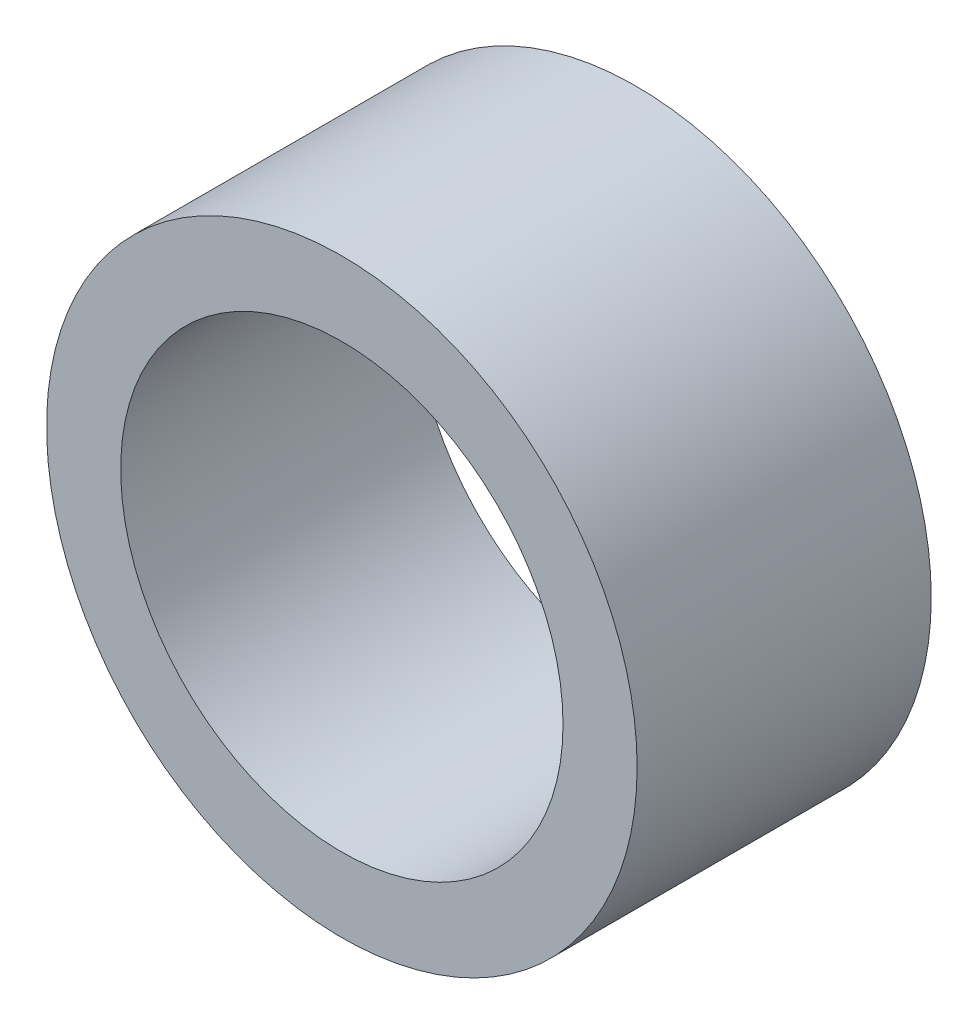
ISO-10303-21;
HEADER;
FILE_DESCRIPTION(('STEP AP214'),'2;1');
FILE_NAME('part.step','',(''),(''),'','','');
FILE_SCHEMA(('AUTOMOTIVE_DESIGN { 1 0 10303 214 1 1 1 1 }'));
ENDSEC;
DATA;
#1=APPLICATION_CONTEXT('core data for automotive mechanical design processes');
#2=APPLICATION_PROTOCOL_DEFINITION('international standard','automotive_design',2000,#1);
#3=PRODUCT_CONTEXT('',#1,'mechanical');
#4=PRODUCT('Part','Part','',(#3));
#5=PRODUCT_RELATED_PRODUCT_CATEGORY('part','',(#4));
#6=PRODUCT_DEFINITION_FORMATION('','',#4);
#7=PRODUCT_DEFINITION_CONTEXT('part definition',#1,'design');
#8=PRODUCT_DEFINITION('design','',#6,#7);
#9=PRODUCT_DEFINITION_SHAPE('','',#8);
#10=(LENGTH_UNIT() NAMED_UNIT(*) SI_UNIT(.MILLI.,.METRE.));
#11=(NAMED_UNIT(*) PLANE_ANGLE_UNIT() SI_UNIT($,.RADIAN.));
#12=(NAMED_UNIT(*) SI_UNIT($,.STERADIAN.) SOLID_ANGLE_UNIT());
#13=UNCERTAINTY_MEASURE_WITH_UNIT(LENGTH_MEASURE(1.E-05),#10,'distance_accuracy_value','');
#14=(GEOMETRIC_REPRESENTATION_CONTEXT(3) GLOBAL_UNCERTAINTY_ASSIGNED_CONTEXT((#13)) GLOBAL_UNIT_ASSIGNED_CONTEXT((#10,
#11,#12)) REPRESENTATION_CONTEXT('',''));
#15=CARTESIAN_POINT('',(0.,0.,0.));
#16=DIRECTION('',(0.,0.,1.));
#17=DIRECTION('',(1.,0.,0.));
#18=AXIS2_PLACEMENT_3D('',#15,#16,#17);
#19=CARTESIAN_POINT('',(0.,0.,3.175));
#20=DIRECTION('',(0.,0.,1.));
#21=DIRECTION('',(1.,0.,0.));
#22=AXIS2_PLACEMENT_3D('',#19,#20,#21);
#23=PLANE('',#22);
#24=CARTESIAN_POINT('',(0.,0.,3.175));
#25=DIRECTION('',(0.,0.,1.));
#26=DIRECTION('',(1.,0.,0.));
#27=AXIS2_PLACEMENT_3D('',#24,#25,#26);
#28=CIRCLE('',#27,6.3754);
#29=CARTESIAN_POINT('',(6.3754,0.,3.175));
#30=VERTEX_POINT('',#29);
#31=EDGE_CURVE('E10',#30,#30,#28,.T.);
#32=ORIENTED_EDGE('',*,*,#31,.T.);
#33=EDGE_LOOP('',(#32));
#34=FACE_BOUND('',#33,.T.);
#35=CARTESIAN_POINT('',(0.,0.,3.175));
#36=DIRECTION('',(0.,0.,1.));
#37=DIRECTION('',(1.,0.,0.));
#38=AXIS2_PLACEMENT_3D('',#35,#36,#37);
#39=CIRCLE('',#38,4.7752);
#40=CARTESIAN_POINT('',(4.7752,0.,3.175));
#41=VERTEX_POINT('',#40);
#42=EDGE_CURVE('E46',#41,#41,#39,.T.);
#43=ORIENTED_EDGE('',*,*,#42,.F.);
#44=EDGE_LOOP('',(#43));
#45=FACE_BOUND('',#44,.T.);
#46=ADVANCED_FACE('F35',(#34,#45),#23,.T.);
#47=CARTESIAN_POINT('',(0.,0.,-3.175));
#48=DIRECTION('',(0.,0.,1.));
#49=DIRECTION('',(1.,0.,0.));
#50=AXIS2_PLACEMENT_3D('',#47,#48,#49);
#51=PLANE('',#50);
#52=CARTESIAN_POINT('',(0.,0.,-3.175));
#53=DIRECTION('',(0.,0.,1.));
#54=DIRECTION('',(1.,0.,0.));
#55=AXIS2_PLACEMENT_3D('',#52,#53,#54);
#56=CIRCLE('',#55,6.3754);
#57=CARTESIAN_POINT('',(6.3754,0.,-3.175));
#58=VERTEX_POINT('',#57);
#59=EDGE_CURVE('E39',#58,#58,#56,.T.);
#60=ORIENTED_EDGE('',*,*,#59,.F.);
#61=EDGE_LOOP('',(#60));
#62=FACE_BOUND('',#61,.T.);
#63=CARTESIAN_POINT('',(0.,0.,-3.175));
#64=DIRECTION('',(0.,0.,1.));
#65=DIRECTION('',(1.,0.,0.));
#66=AXIS2_PLACEMENT_3D('',#63,#64,#65);
#67=CIRCLE('',#66,4.7752);
#68=CARTESIAN_POINT('',(4.7752,0.,-3.175));
#69=VERTEX_POINT('',#68);
#70=EDGE_CURVE('E48',#69,#69,#67,.T.);
#71=ORIENTED_EDGE('',*,*,#70,.T.);
#72=EDGE_LOOP('',(#71));
#73=FACE_BOUND('',#72,.T.);
#74=ADVANCED_FACE('F58',(#62,#73),#51,.F.);
#75=CARTESIAN_POINT('',(0.,0.,3.175));
#76=DIRECTION('',(0.,0.,-1.));
#77=DIRECTION('',(-1.,0.,0.));
#78=AXIS2_PLACEMENT_3D('',#75,#76,#77);
#79=CYLINDRICAL_SURFACE('',#78,6.3754);
#80=ORIENTED_EDGE('',*,*,#31,.F.);
#81=EDGE_LOOP('',(#80));
#82=FACE_BOUND('',#81,.T.);
#83=ORIENTED_EDGE('',*,*,#59,.T.);
#84=EDGE_LOOP('',(#83));
#85=FACE_BOUND('',#84,.T.);
#86=ADVANCED_FACE('F37',(#82,#85),#79,.T.);
#87=CARTESIAN_POINT('',(0.,0.,3.175));
#88=DIRECTION('',(0.,0.,-1.));
#89=DIRECTION('',(-1.,0.,0.));
#90=AXIS2_PLACEMENT_3D('',#87,#88,#89);
#91=CYLINDRICAL_SURFACE('',#90,4.7752);
#92=ORIENTED_EDGE('',*,*,#42,.T.);
#93=EDGE_LOOP('',(#92));
#94=FACE_BOUND('',#93,.T.);
#95=ORIENTED_EDGE('',*,*,#70,.F.);
#96=EDGE_LOOP('',(#95));
#97=FACE_BOUND('',#96,.T.);
#98=ADVANCED_FACE('F54',(#94,#97),#91,.F.);
#99=CLOSED_SHELL('',(#46,#74,#86,#98));
#100=MANIFOLD_SOLID_BREP('B2',#99);
#101=ADVANCED_BREP_SHAPE_REPRESENTATION('',(#18,#100),#14);
#102=SHAPE_DEFINITION_REPRESENTATION(#9,#101);
ENDSEC;
END-ISO-10303-21;
